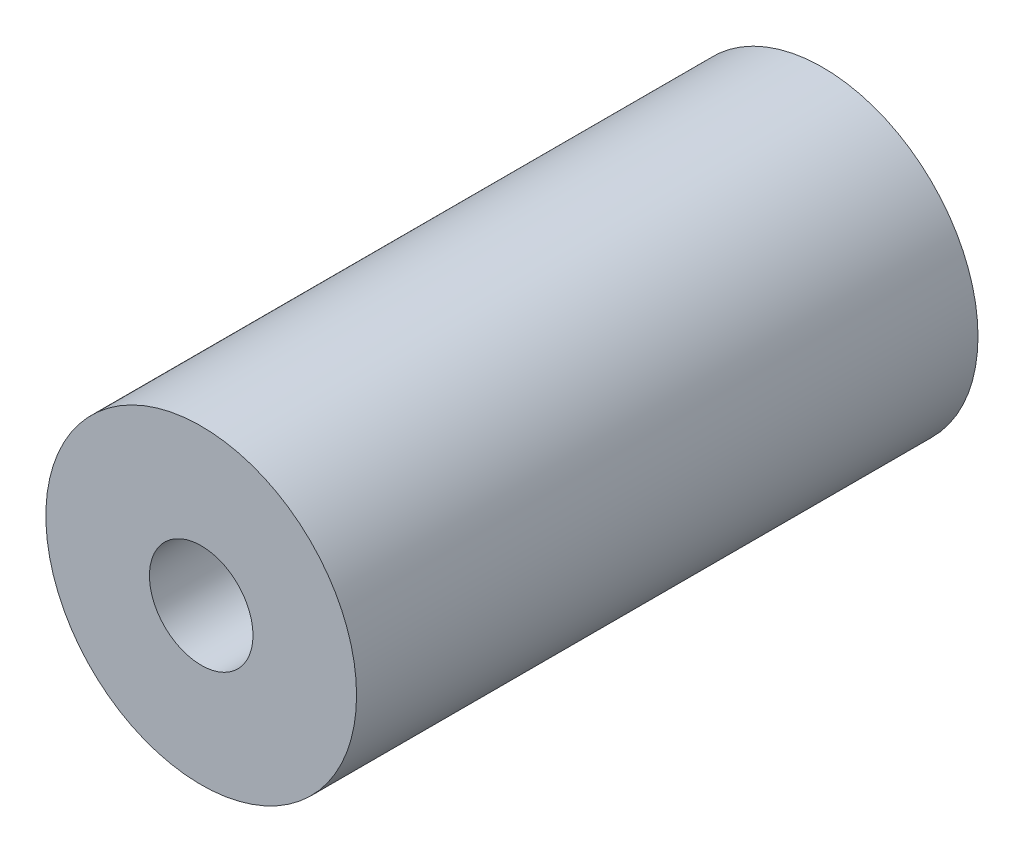
ISO-10303-21;
HEADER;
FILE_DESCRIPTION(('STEP AP214'),'2;1');
FILE_NAME('part.step','',(''),(''),'','','');
FILE_SCHEMA(('AUTOMOTIVE_DESIGN { 1 0 10303 214 1 1 1 1 }'));
ENDSEC;
DATA;
#1=APPLICATION_CONTEXT('core data for automotive mechanical design processes');
#2=APPLICATION_PROTOCOL_DEFINITION('international standard','automotive_design',2000,#1);
#3=PRODUCT_CONTEXT('',#1,'mechanical');
#4=PRODUCT('Part','Part','',(#3));
#5=PRODUCT_RELATED_PRODUCT_CATEGORY('part','',(#4));
#6=PRODUCT_DEFINITION_FORMATION('','',#4);
#7=PRODUCT_DEFINITION_CONTEXT('part definition',#1,'design');
#8=PRODUCT_DEFINITION('design','',#6,#7);
#9=PRODUCT_DEFINITION_SHAPE('','',#8);
#10=(LENGTH_UNIT() NAMED_UNIT(*) SI_UNIT(.MILLI.,.METRE.));
#11=(NAMED_UNIT(*) PLANE_ANGLE_UNIT() SI_UNIT($,.RADIAN.));
#12=(NAMED_UNIT(*) SI_UNIT($,.STERADIAN.) SOLID_ANGLE_UNIT());
#13=UNCERTAINTY_MEASURE_WITH_UNIT(LENGTH_MEASURE(1.E-05),#10,'distance_accuracy_value','');
#14=(GEOMETRIC_REPRESENTATION_CONTEXT(3) GLOBAL_UNCERTAINTY_ASSIGNED_CONTEXT((#13)) GLOBAL_UNIT_ASSIGNED_CONTEXT((#10,
#11,#12)) REPRESENTATION_CONTEXT('',''));
#15=CARTESIAN_POINT('',(0.,0.,0.));
#16=DIRECTION('',(0.,0.,1.));
#17=DIRECTION('',(1.,0.,0.));
#18=AXIS2_PLACEMENT_3D('',#15,#16,#17);
#19=CARTESIAN_POINT('',(0.,0.,-60.));
#20=DIRECTION('',(0.,0.,1.));
#21=DIRECTION('',(1.,0.,0.));
#22=AXIS2_PLACEMENT_3D('',#19,#20,#21);
#23=CYLINDRICAL_SURFACE('',#22,15.);
#24=CARTESIAN_POINT('',(0.,0.,-60.));
#25=DIRECTION('',(0.,0.,1.));
#26=DIRECTION('',(1.,0.,0.));
#27=AXIS2_PLACEMENT_3D('',#24,#25,#26);
#28=CIRCLE('',#27,15.);
#29=CARTESIAN_POINT('',(15.,0.,-60.));
#30=VERTEX_POINT('',#29);
#31=EDGE_CURVE('E10',#30,#30,#28,.T.);
#32=ORIENTED_EDGE('',*,*,#31,.T.);
#33=EDGE_LOOP('',(#32));
#34=FACE_BOUND('',#33,.T.);
#35=CARTESIAN_POINT('',(0.,0.,0.));
#36=DIRECTION('',(0.,0.,1.));
#37=DIRECTION('',(1.,0.,0.));
#38=AXIS2_PLACEMENT_3D('',#35,#36,#37);
#39=CIRCLE('',#38,15.);
#40=CARTESIAN_POINT('',(15.,0.,0.));
#41=VERTEX_POINT('',#40);
#42=EDGE_CURVE('E40',#41,#41,#39,.T.);
#43=ORIENTED_EDGE('',*,*,#42,.F.);
#44=EDGE_LOOP('',(#43));
#45=FACE_BOUND('',#44,.T.);
#46=ADVANCED_FACE('F37',(#34,#45),#23,.T.);
#47=CARTESIAN_POINT('',(0.,0.,-60.));
#48=DIRECTION('',(0.,0.,1.));
#49=DIRECTION('',(1.,0.,0.));
#50=AXIS2_PLACEMENT_3D('',#47,#48,#49);
#51=PLANE('',#50);
#52=CARTESIAN_POINT('',(0.,0.,-60.));
#53=DIRECTION('',(0.,0.,1.));
#54=DIRECTION('',(1.,0.,0.));
#55=AXIS2_PLACEMENT_3D('',#52,#53,#54);
#56=CIRCLE('',#55,5.);
#57=CARTESIAN_POINT('',(5.,0.,-60.));
#58=VERTEX_POINT('',#57);
#59=EDGE_CURVE('E49',#58,#58,#56,.T.);
#60=ORIENTED_EDGE('',*,*,#59,.T.);
#61=EDGE_LOOP('',(#60));
#62=FACE_BOUND('',#61,.T.);
#63=ORIENTED_EDGE('',*,*,#31,.F.);
#64=EDGE_LOOP('',(#63));
#65=FACE_BOUND('',#64,.T.);
#66=ADVANCED_FACE('F59',(#62,#65),#51,.F.);
#67=CARTESIAN_POINT('',(0.,0.,0.));
#68=DIRECTION('',(0.,0.,1.));
#69=DIRECTION('',(1.,0.,0.));
#70=AXIS2_PLACEMENT_3D('',#67,#68,#69);
#71=PLANE('',#70);
#72=CARTESIAN_POINT('',(0.,0.,0.));
#73=DIRECTION('',(0.,0.,1.));
#74=DIRECTION('',(1.,0.,0.));
#75=AXIS2_PLACEMENT_3D('',#72,#73,#74);
#76=CIRCLE('',#75,5.);
#77=CARTESIAN_POINT('',(5.,0.,0.));
#78=VERTEX_POINT('',#77);
#79=EDGE_CURVE('E51',#78,#78,#76,.T.);
#80=ORIENTED_EDGE('',*,*,#79,.F.);
#81=EDGE_LOOP('',(#80));
#82=FACE_BOUND('',#81,.T.);
#83=ORIENTED_EDGE('',*,*,#42,.T.);
#84=EDGE_LOOP('',(#83));
#85=FACE_BOUND('',#84,.T.);
#86=ADVANCED_FACE('F65',(#82,#85),#71,.T.);
#87=CARTESIAN_POINT('',(0.,0.,-60.));
#88=DIRECTION('',(0.,0.,1.));
#89=DIRECTION('',(1.,0.,0.));
#90=AXIS2_PLACEMENT_3D('',#87,#88,#89);
#91=CYLINDRICAL_SURFACE('',#90,5.);
#92=ORIENTED_EDGE('',*,*,#59,.F.);
#93=EDGE_LOOP('',(#92));
#94=FACE_BOUND('',#93,.T.);
#95=ORIENTED_EDGE('',*,*,#79,.T.);
#96=EDGE_LOOP('',(#95));
#97=FACE_BOUND('',#96,.T.);
#98=ADVANCED_FACE('F62',(#94,#97),#91,.F.);
#99=CLOSED_SHELL('',(#46,#66,#86,#98));
#100=MANIFOLD_SOLID_BREP('B2',#99);
#101=ADVANCED_BREP_SHAPE_REPRESENTATION('',(#18,#100),#14);
#102=SHAPE_DEFINITION_REPRESENTATION(#9,#101);
ENDSEC;
END-ISO-10303-21;
